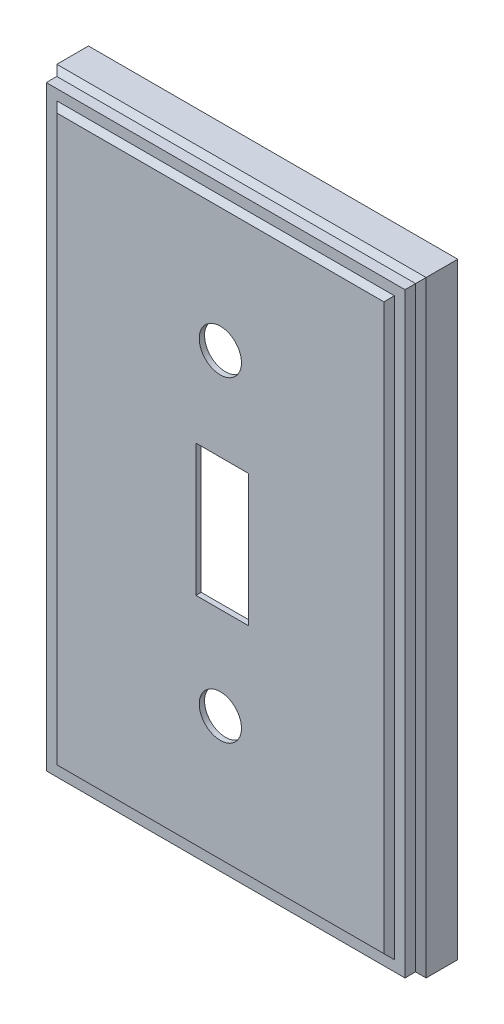
ISO-10303-21;
HEADER;
FILE_DESCRIPTION(('STEP AP214'),'2;1');
FILE_NAME('part.step','',(''),(''),'','','');
FILE_SCHEMA(('AUTOMOTIVE_DESIGN { 1 0 10303 214 1 1 1 1 }'));
ENDSEC;
DATA;
#1=APPLICATION_CONTEXT('core data for automotive mechanical design processes');
#2=APPLICATION_PROTOCOL_DEFINITION('international standard','automotive_design',2000,#1);
#3=PRODUCT_CONTEXT('',#1,'mechanical');
#4=PRODUCT('Part','Part','',(#3));
#5=PRODUCT_RELATED_PRODUCT_CATEGORY('part','',(#4));
#6=PRODUCT_DEFINITION_FORMATION('','',#4);
#7=PRODUCT_DEFINITION_CONTEXT('part definition',#1,'design');
#8=PRODUCT_DEFINITION('design','',#6,#7);
#9=PRODUCT_DEFINITION_SHAPE('','',#8);
#10=(LENGTH_UNIT() NAMED_UNIT(*) SI_UNIT(.MILLI.,.METRE.));
#11=(NAMED_UNIT(*) PLANE_ANGLE_UNIT() SI_UNIT($,.RADIAN.));
#12=(NAMED_UNIT(*) SI_UNIT($,.STERADIAN.) SOLID_ANGLE_UNIT());
#13=UNCERTAINTY_MEASURE_WITH_UNIT(LENGTH_MEASURE(1.E-05),#10,'distance_accuracy_value','');
#14=(GEOMETRIC_REPRESENTATION_CONTEXT(3) GLOBAL_UNCERTAINTY_ASSIGNED_CONTEXT((#13)) GLOBAL_UNIT_ASSIGNED_CONTEXT((#10,
#11,#12)) REPRESENTATION_CONTEXT('',''));
#15=CARTESIAN_POINT('',(0.,0.,0.));
#16=DIRECTION('',(0.,0.,1.));
#17=DIRECTION('',(1.,0.,0.));
#18=AXIS2_PLACEMENT_3D('',#15,#16,#17);
#19=CARTESIAN_POINT('',(0.,0.,10.));
#20=DIRECTION('',(1.,0.,0.));
#21=DIRECTION('',(0.,1.,0.));
#22=AXIS2_PLACEMENT_3D('',#19,#20,#21);
#23=PLANE('',#22);
#24=DIRECTION('',(0.,0.,-1.));
#25=VECTOR('',#24,1.);
#26=CARTESIAN_POINT('',(0.,-115.,10.));
#27=LINE('',#26,#25);
#28=CARTESIAN_POINT('',(0.,-115.,6.00000000000001));
#29=VERTEX_POINT('',#28);
#30=CARTESIAN_POINT('',(0.,-115.,0.));
#31=VERTEX_POINT('',#30);
#32=EDGE_CURVE('E225',#29,#31,#27,.T.);
#33=ORIENTED_EDGE('',*,*,#32,.F.);
#34=DIRECTION('',(0.,1.,0.));
#35=VECTOR('',#34,1.);
#36=CARTESIAN_POINT('',(0.,0.,6.00000000000001));
#37=LINE('',#36,#35);
#38=CARTESIAN_POINT('',(0.,0.,6.00000000000001));
#39=VERTEX_POINT('',#38);
#40=EDGE_CURVE('E57',#29,#39,#37,.T.);
#41=ORIENTED_EDGE('',*,*,#40,.T.);
#42=DIRECTION('',(0.,0.,-1.));
#43=VECTOR('',#42,1.);
#44=CARTESIAN_POINT('',(0.,0.,10.));
#45=LINE('',#44,#43);
#46=CARTESIAN_POINT('',(0.,0.,0.));
#47=VERTEX_POINT('',#46);
#48=EDGE_CURVE('E219',#39,#47,#45,.T.);
#49=ORIENTED_EDGE('',*,*,#48,.T.);
#50=DIRECTION('',(0.,-1.,0.));
#51=VECTOR('',#50,1.);
#52=CARTESIAN_POINT('',(0.,0.,0.));
#53=LINE('',#52,#51);
#54=EDGE_CURVE('E179',#47,#31,#53,.T.);
#55=ORIENTED_EDGE('',*,*,#54,.T.);
#56=EDGE_LOOP('',(#33,#41,#49,#55));
#57=FACE_BOUND('',#56,.T.);
#58=ADVANCED_FACE('F33',(#57),#23,.F.);
#59=CARTESIAN_POINT('',(0.,-115.,10.));
#60=DIRECTION('',(0.,1.,0.));
#61=DIRECTION('',(0.,0.,1.));
#62=AXIS2_PLACEMENT_3D('',#59,#60,#61);
#63=PLANE('',#62);
#64=DIRECTION('',(0.,0.,-1.));
#65=VECTOR('',#64,1.);
#66=CARTESIAN_POINT('',(70.,-115.,10.));
#67=LINE('',#66,#65);
#68=CARTESIAN_POINT('',(70.,-115.,6.00000000000001));
#69=VERTEX_POINT('',#68);
#70=CARTESIAN_POINT('',(70.,-115.,0.));
#71=VERTEX_POINT('',#70);
#72=EDGE_CURVE('E223',#69,#71,#67,.T.);
#73=ORIENTED_EDGE('',*,*,#72,.F.);
#74=DIRECTION('',(-1.,0.,0.));
#75=VECTOR('',#74,1.);
#76=CARTESIAN_POINT('',(0.,-115.,6.00000000000001));
#77=LINE('',#76,#75);
#78=EDGE_CURVE('E249',#69,#29,#77,.T.);
#79=ORIENTED_EDGE('',*,*,#78,.T.);
#80=ORIENTED_EDGE('',*,*,#32,.T.);
#81=DIRECTION('',(1.,0.,0.));
#82=VECTOR('',#81,1.);
#83=CARTESIAN_POINT('',(0.,-115.,0.));
#84=LINE('',#83,#82);
#85=EDGE_CURVE('E210',#31,#71,#84,.T.);
#86=ORIENTED_EDGE('',*,*,#85,.T.);
#87=EDGE_LOOP('',(#73,#79,#80,#86));
#88=FACE_BOUND('',#87,.T.);
#89=ADVANCED_FACE('F291',(#88),#63,.F.);
#90=CARTESIAN_POINT('',(70.,0.,10.));
#91=DIRECTION('',(-1.,0.,0.));
#92=DIRECTION('',(0.,-1.,0.));
#93=AXIS2_PLACEMENT_3D('',#90,#91,#92);
#94=PLANE('',#93);
#95=DIRECTION('',(0.,0.,-1.));
#96=VECTOR('',#95,1.);
#97=CARTESIAN_POINT('',(70.,0.,10.));
#98=LINE('',#97,#96);
#99=CARTESIAN_POINT('',(70.,0.,6.00000000000001));
#100=VERTEX_POINT('',#99);
#101=CARTESIAN_POINT('',(70.,0.,0.));
#102=VERTEX_POINT('',#101);
#103=EDGE_CURVE('E221',#100,#102,#98,.T.);
#104=ORIENTED_EDGE('',*,*,#103,.F.);
#105=DIRECTION('',(0.,-1.,0.));
#106=VECTOR('',#105,1.);
#107=CARTESIAN_POINT('',(70.,-115.,6.00000000000001));
#108=LINE('',#107,#106);
#109=EDGE_CURVE('E11',#100,#69,#108,.T.);
#110=ORIENTED_EDGE('',*,*,#109,.T.);
#111=ORIENTED_EDGE('',*,*,#72,.T.);
#112=DIRECTION('',(0.,1.,0.));
#113=VECTOR('',#112,1.);
#114=CARTESIAN_POINT('',(70.,0.,0.));
#115=LINE('',#114,#113);
#116=EDGE_CURVE('E213',#71,#102,#115,.T.);
#117=ORIENTED_EDGE('',*,*,#116,.T.);
#118=EDGE_LOOP('',(#104,#110,#111,#117));
#119=FACE_BOUND('',#118,.T.);
#120=ADVANCED_FACE('F287',(#119),#94,.F.);
#121=CARTESIAN_POINT('',(0.,0.,10.));
#122=DIRECTION('',(0.,-1.,0.));
#123=DIRECTION('',(0.,0.,-1.));
#124=AXIS2_PLACEMENT_3D('',#121,#122,#123);
#125=PLANE('',#124);
#126=ORIENTED_EDGE('',*,*,#48,.F.);
#127=DIRECTION('',(1.,0.,0.));
#128=VECTOR('',#127,1.);
#129=CARTESIAN_POINT('',(70.,0.,6.00000000000001));
#130=LINE('',#129,#128);
#131=EDGE_CURVE('E42',#39,#100,#130,.T.);
#132=ORIENTED_EDGE('',*,*,#131,.T.);
#133=ORIENTED_EDGE('',*,*,#103,.T.);
#134=DIRECTION('',(-1.,0.,0.));
#135=VECTOR('',#134,1.);
#136=CARTESIAN_POINT('',(0.,0.,0.));
#137=LINE('',#136,#135);
#138=EDGE_CURVE('E216',#102,#47,#137,.T.);
#139=ORIENTED_EDGE('',*,*,#138,.T.);
#140=EDGE_LOOP('',(#126,#132,#133,#139));
#141=FACE_BOUND('',#140,.T.);
#142=ADVANCED_FACE('F277',(#141),#125,.F.);
#143=CARTESIAN_POINT('',(0.,0.,10.));
#144=DIRECTION('',(0.,0.,1.));
#145=DIRECTION('',(1.,0.,0.));
#146=AXIS2_PLACEMENT_3D('',#143,#144,#145);
#147=PLANE('',#146);
#148=DIRECTION('',(0.,-1.,0.));
#149=VECTOR('',#148,1.);
#150=CARTESIAN_POINT('',(4.,-115.,10.));
#151=LINE('',#150,#149);
#152=CARTESIAN_POINT('',(3.99999999999999,-3.99999999999999,10.));
#153=VERTEX_POINT('',#152);
#154=CARTESIAN_POINT('',(4.,-111.,10.));
#155=VERTEX_POINT('',#154);
#156=EDGE_CURVE('E244',#153,#155,#151,.T.);
#157=ORIENTED_EDGE('',*,*,#156,.T.);
#158=DIRECTION('',(1.,0.,0.));
#159=VECTOR('',#158,1.);
#160=CARTESIAN_POINT('',(70.,-111.,10.));
#161=LINE('',#160,#159);
#162=CARTESIAN_POINT('',(66.,-111.,10.));
#163=VERTEX_POINT('',#162);
#164=EDGE_CURVE('E246',#155,#163,#161,.T.);
#165=ORIENTED_EDGE('',*,*,#164,.T.);
#166=DIRECTION('',(0.,1.,0.));
#167=VECTOR('',#166,1.);
#168=CARTESIAN_POINT('',(66.,0.,10.));
#169=LINE('',#168,#167);
#170=CARTESIAN_POINT('',(66.,-3.99999999999999,10.));
#171=VERTEX_POINT('',#170);
#172=EDGE_CURVE('E238',#163,#171,#169,.T.);
#173=ORIENTED_EDGE('',*,*,#172,.T.);
#174=DIRECTION('',(-1.,0.,0.));
#175=VECTOR('',#174,1.);
#176=CARTESIAN_POINT('',(0.,-3.99999999999999,10.));
#177=LINE('',#176,#175);
#178=EDGE_CURVE('E242',#171,#153,#177,.T.);
#179=ORIENTED_EDGE('',*,*,#178,.T.);
#180=EDGE_LOOP('',(#157,#165,#173,#179));
#181=FACE_BOUND('',#180,.T.);
#182=CARTESIAN_POINT('',(35.,-87.5,10.));
#183=DIRECTION('',(0.,0.,1.));
#184=DIRECTION('',(1.,0.,0.));
#185=AXIS2_PLACEMENT_3D('',#182,#183,#184);
#186=CIRCLE('',#185,4.00000000000001);
#187=CARTESIAN_POINT('',(39.,-87.5,10.));
#188=VERTEX_POINT('',#187);
#189=EDGE_CURVE('E168',#188,#188,#186,.T.);
#190=ORIENTED_EDGE('',*,*,#189,.F.);
#191=EDGE_LOOP('',(#190));
#192=FACE_BOUND('',#191,.T.);
#193=DIRECTION('',(0.,-1.,0.));
#194=VECTOR('',#193,1.);
#195=CARTESIAN_POINT('',(30.369677272136,-45.,10.));
#196=LINE('',#195,#194);
#197=CARTESIAN_POINT('',(30.369677272136,-45.,10.));
#198=VERTEX_POINT('',#197);
#199=CARTESIAN_POINT('',(30.369677272136,-70.,10.));
#200=VERTEX_POINT('',#199);
#201=EDGE_CURVE('E156',#198,#200,#196,.T.);
#202=ORIENTED_EDGE('',*,*,#201,.F.);
#203=DIRECTION('',(-1.,0.,0.));
#204=VECTOR('',#203,1.);
#205=CARTESIAN_POINT('',(30.369677272136,-45.,10.));
#206=LINE('',#205,#204);
#207=CARTESIAN_POINT('',(40.369677272136,-45.,10.));
#208=VERTEX_POINT('',#207);
#209=EDGE_CURVE('E161',#208,#198,#206,.T.);
#210=ORIENTED_EDGE('',*,*,#209,.F.);
#211=DIRECTION('',(0.,1.,0.));
#212=VECTOR('',#211,1.);
#213=CARTESIAN_POINT('',(40.369677272136,-45.,10.));
#214=LINE('',#213,#212);
#215=CARTESIAN_POINT('',(40.369677272136,-70.,10.));
#216=VERTEX_POINT('',#215);
#217=EDGE_CURVE('E140',#216,#208,#214,.T.);
#218=ORIENTED_EDGE('',*,*,#217,.F.);
#219=DIRECTION('',(1.,0.,0.));
#220=VECTOR('',#219,1.);
#221=CARTESIAN_POINT('',(30.369677272136,-70.,10.));
#222=LINE('',#221,#220);
#223=EDGE_CURVE('E151',#200,#216,#222,.T.);
#224=ORIENTED_EDGE('',*,*,#223,.F.);
#225=EDGE_LOOP('',(#202,#210,#218,#224));
#226=FACE_BOUND('',#225,.T.);
#227=CARTESIAN_POINT('',(35.,-27.5,10.));
#228=DIRECTION('',(0.,0.,1.));
#229=DIRECTION('',(1.,0.,0.));
#230=AXIS2_PLACEMENT_3D('',#227,#228,#229);
#231=CIRCLE('',#230,4.00000000000001);
#232=CARTESIAN_POINT('',(39.,-27.5,10.));
#233=VERTEX_POINT('',#232);
#234=EDGE_CURVE('E171',#233,#233,#231,.T.);
#235=ORIENTED_EDGE('',*,*,#234,.F.);
#236=EDGE_LOOP('',(#235));
#237=FACE_BOUND('',#236,.T.);
#238=ADVANCED_FACE('F158',(#181,#192,#226,#237),#147,.T.);
#239=CARTESIAN_POINT('',(0.,0.,0.));
#240=DIRECTION('',(0.,0.,1.));
#241=DIRECTION('',(1.,0.,0.));
#242=AXIS2_PLACEMENT_3D('',#239,#240,#241);
#243=PLANE('',#242);
#244=DIRECTION('',(-1.,0.,0.));
#245=VECTOR('',#244,1.);
#246=CARTESIAN_POINT('',(0.,-1.,0.));
#247=LINE('',#246,#245);
#248=CARTESIAN_POINT('',(69.,-1.,0.));
#249=VERTEX_POINT('',#248);
#250=CARTESIAN_POINT('',(1.,-1.,0.));
#251=VERTEX_POINT('',#250);
#252=EDGE_CURVE('E185',#249,#251,#247,.T.);
#253=ORIENTED_EDGE('',*,*,#252,.T.);
#254=DIRECTION('',(0.,-1.,0.));
#255=VECTOR('',#254,1.);
#256=CARTESIAN_POINT('',(1.,0.,0.));
#257=LINE('',#256,#255);
#258=CARTESIAN_POINT('',(1.00000000000001,-114.,0.));
#259=VERTEX_POINT('',#258);
#260=EDGE_CURVE('E197',#251,#259,#257,.T.);
#261=ORIENTED_EDGE('',*,*,#260,.T.);
#262=DIRECTION('',(1.,0.,0.));
#263=VECTOR('',#262,1.);
#264=CARTESIAN_POINT('',(0.,-114.,0.));
#265=LINE('',#264,#263);
#266=CARTESIAN_POINT('',(69.,-114.,0.));
#267=VERTEX_POINT('',#266);
#268=EDGE_CURVE('E200',#259,#267,#265,.T.);
#269=ORIENTED_EDGE('',*,*,#268,.T.);
#270=DIRECTION('',(0.,1.,0.));
#271=VECTOR('',#270,1.);
#272=CARTESIAN_POINT('',(69.,0.,0.));
#273=LINE('',#272,#271);
#274=EDGE_CURVE('E203',#267,#249,#273,.T.);
#275=ORIENTED_EDGE('',*,*,#274,.T.);
#276=EDGE_LOOP('',(#253,#261,#269,#275));
#277=FACE_BOUND('',#276,.T.);
#278=ORIENTED_EDGE('',*,*,#54,.F.);
#279=ORIENTED_EDGE('',*,*,#138,.F.);
#280=ORIENTED_EDGE('',*,*,#116,.F.);
#281=ORIENTED_EDGE('',*,*,#85,.F.);
#282=EDGE_LOOP('',(#278,#279,#280,#281));
#283=FACE_BOUND('',#282,.T.);
#284=ADVANCED_FACE('F276',(#277,#283),#243,.F.);
#285=CARTESIAN_POINT('',(1.,0.,10.));
#286=DIRECTION('',(1.,0.,0.));
#287=DIRECTION('',(0.,1.,0.));
#288=AXIS2_PLACEMENT_3D('',#285,#286,#287);
#289=PLANE('',#288);
#290=ORIENTED_EDGE('',*,*,#260,.F.);
#291=DIRECTION('',(0.,0.,-1.));
#292=VECTOR('',#291,1.);
#293=CARTESIAN_POINT('',(1.,-1.,10.));
#294=LINE('',#293,#292);
#295=CARTESIAN_POINT('',(1.,-1.,9.));
#296=VERTEX_POINT('',#295);
#297=EDGE_CURVE('E186',#296,#251,#294,.T.);
#298=ORIENTED_EDGE('',*,*,#297,.F.);
#299=DIRECTION('',(0.,-1.,0.));
#300=VECTOR('',#299,1.);
#301=CARTESIAN_POINT('',(1.,0.,9.));
#302=LINE('',#301,#300);
#303=CARTESIAN_POINT('',(1.00000000000001,-114.,9.));
#304=VERTEX_POINT('',#303);
#305=EDGE_CURVE('E181',#296,#304,#302,.T.);
#306=ORIENTED_EDGE('',*,*,#305,.T.);
#307=DIRECTION('',(0.,0.,-1.));
#308=VECTOR('',#307,1.);
#309=CARTESIAN_POINT('',(1.00000000000001,-114.,10.));
#310=LINE('',#309,#308);
#311=EDGE_CURVE('E176',#304,#259,#310,.T.);
#312=ORIENTED_EDGE('',*,*,#311,.T.);
#313=EDGE_LOOP('',(#290,#298,#306,#312));
#314=FACE_BOUND('',#313,.T.);
#315=ADVANCED_FACE('F284',(#314),#289,.T.);
#316=CARTESIAN_POINT('',(0.,-114.,10.));
#317=DIRECTION('',(0.,1.,0.));
#318=DIRECTION('',(0.,0.,1.));
#319=AXIS2_PLACEMENT_3D('',#316,#317,#318);
#320=PLANE('',#319);
#321=ORIENTED_EDGE('',*,*,#268,.F.);
#322=ORIENTED_EDGE('',*,*,#311,.F.);
#323=DIRECTION('',(1.,0.,0.));
#324=VECTOR('',#323,1.);
#325=CARTESIAN_POINT('',(0.,-114.,9.));
#326=LINE('',#325,#324);
#327=CARTESIAN_POINT('',(69.,-114.,9.));
#328=VERTEX_POINT('',#327);
#329=EDGE_CURVE('E184',#304,#328,#326,.T.);
#330=ORIENTED_EDGE('',*,*,#329,.T.);
#331=DIRECTION('',(0.,0.,-1.));
#332=VECTOR('',#331,1.);
#333=CARTESIAN_POINT('',(69.,-114.,10.));
#334=LINE('',#333,#332);
#335=EDGE_CURVE('E180',#328,#267,#334,.T.);
#336=ORIENTED_EDGE('',*,*,#335,.T.);
#337=EDGE_LOOP('',(#321,#322,#330,#336));
#338=FACE_BOUND('',#337,.T.);
#339=ADVANCED_FACE('F435',(#338),#320,.T.);
#340=CARTESIAN_POINT('',(69.,0.,10.));
#341=DIRECTION('',(-1.,0.,0.));
#342=DIRECTION('',(0.,-1.,0.));
#343=AXIS2_PLACEMENT_3D('',#340,#341,#342);
#344=PLANE('',#343);
#345=ORIENTED_EDGE('',*,*,#274,.F.);
#346=ORIENTED_EDGE('',*,*,#335,.F.);
#347=DIRECTION('',(0.,1.,0.));
#348=VECTOR('',#347,1.);
#349=CARTESIAN_POINT('',(69.,0.,9.));
#350=LINE('',#349,#348);
#351=CARTESIAN_POINT('',(69.,-1.,9.));
#352=VERTEX_POINT('',#351);
#353=EDGE_CURVE('E193',#328,#352,#350,.T.);
#354=ORIENTED_EDGE('',*,*,#353,.T.);
#355=DIRECTION('',(0.,0.,-1.));
#356=VECTOR('',#355,1.);
#357=CARTESIAN_POINT('',(69.,-1.,10.));
#358=LINE('',#357,#356);
#359=EDGE_CURVE('E188',#352,#249,#358,.T.);
#360=ORIENTED_EDGE('',*,*,#359,.T.);
#361=EDGE_LOOP('',(#345,#346,#354,#360));
#362=FACE_BOUND('',#361,.T.);
#363=ADVANCED_FACE('F426',(#362),#344,.T.);
#364=CARTESIAN_POINT('',(0.,-1.,10.));
#365=DIRECTION('',(0.,-1.,0.));
#366=DIRECTION('',(0.,0.,-1.));
#367=AXIS2_PLACEMENT_3D('',#364,#365,#366);
#368=PLANE('',#367);
#369=ORIENTED_EDGE('',*,*,#252,.F.);
#370=ORIENTED_EDGE('',*,*,#359,.F.);
#371=DIRECTION('',(-1.,0.,0.));
#372=VECTOR('',#371,1.);
#373=CARTESIAN_POINT('',(0.,-1.,9.));
#374=LINE('',#373,#372);
#375=EDGE_CURVE('E189',#352,#296,#374,.T.);
#376=ORIENTED_EDGE('',*,*,#375,.T.);
#377=ORIENTED_EDGE('',*,*,#297,.T.);
#378=EDGE_LOOP('',(#369,#370,#376,#377));
#379=FACE_BOUND('',#378,.T.);
#380=ADVANCED_FACE('F418',(#379),#368,.T.);
#381=CARTESIAN_POINT('',(0.,0.,9.));
#382=DIRECTION('',(0.,0.,1.));
#383=DIRECTION('',(1.,0.,0.));
#384=AXIS2_PLACEMENT_3D('',#381,#382,#383);
#385=PLANE('',#384);
#386=CARTESIAN_POINT('',(35.,-87.5,9.));
#387=DIRECTION('',(0.,0.,1.));
#388=DIRECTION('',(1.,0.,0.));
#389=AXIS2_PLACEMENT_3D('',#386,#387,#388);
#390=CIRCLE('',#389,4.00000000000001);
#391=CARTESIAN_POINT('',(39.,-87.5,9.));
#392=VERTEX_POINT('',#391);
#393=EDGE_CURVE('E175',#392,#392,#390,.T.);
#394=ORIENTED_EDGE('',*,*,#393,.T.);
#395=EDGE_LOOP('',(#394));
#396=FACE_BOUND('',#395,.T.);
#397=DIRECTION('',(-1.,0.,0.));
#398=VECTOR('',#397,1.);
#399=CARTESIAN_POINT('',(0.,-45.,9.));
#400=LINE('',#399,#398);
#401=CARTESIAN_POINT('',(40.369677272136,-45.,9.));
#402=VERTEX_POINT('',#401);
#403=CARTESIAN_POINT('',(30.369677272136,-45.,9.));
#404=VERTEX_POINT('',#403);
#405=EDGE_CURVE('E232',#402,#404,#400,.T.);
#406=ORIENTED_EDGE('',*,*,#405,.T.);
#407=DIRECTION('',(0.,-1.,0.));
#408=VECTOR('',#407,1.);
#409=CARTESIAN_POINT('',(30.3696772721359,0.,9.));
#410=LINE('',#409,#408);
#411=CARTESIAN_POINT('',(30.369677272136,-70.,9.));
#412=VERTEX_POINT('',#411);
#413=EDGE_CURVE('E235',#404,#412,#410,.T.);
#414=ORIENTED_EDGE('',*,*,#413,.T.);
#415=DIRECTION('',(1.,0.,0.));
#416=VECTOR('',#415,1.);
#417=CARTESIAN_POINT('',(0.,-70.,9.));
#418=LINE('',#417,#416);
#419=CARTESIAN_POINT('',(40.369677272136,-70.,9.));
#420=VERTEX_POINT('',#419);
#421=EDGE_CURVE('E227',#412,#420,#418,.T.);
#422=ORIENTED_EDGE('',*,*,#421,.T.);
#423=DIRECTION('',(0.,1.,0.));
#424=VECTOR('',#423,1.);
#425=CARTESIAN_POINT('',(40.3696772721359,0.,9.));
#426=LINE('',#425,#424);
#427=EDGE_CURVE('E143',#420,#402,#426,.T.);
#428=ORIENTED_EDGE('',*,*,#427,.T.);
#429=EDGE_LOOP('',(#406,#414,#422,#428));
#430=FACE_BOUND('',#429,.T.);
#431=CARTESIAN_POINT('',(35.,-27.5,9.));
#432=DIRECTION('',(0.,0.,1.));
#433=DIRECTION('',(1.,0.,0.));
#434=AXIS2_PLACEMENT_3D('',#431,#432,#433);
#435=CIRCLE('',#434,4.00000000000001);
#436=CARTESIAN_POINT('',(39.,-27.5,9.));
#437=VERTEX_POINT('',#436);
#438=EDGE_CURVE('E174',#437,#437,#435,.T.);
#439=ORIENTED_EDGE('',*,*,#438,.T.);
#440=EDGE_LOOP('',(#439));
#441=FACE_BOUND('',#440,.T.);
#442=ORIENTED_EDGE('',*,*,#305,.F.);
#443=ORIENTED_EDGE('',*,*,#375,.F.);
#444=ORIENTED_EDGE('',*,*,#353,.F.);
#445=ORIENTED_EDGE('',*,*,#329,.F.);
#446=EDGE_LOOP('',(#442,#443,#444,#445));
#447=FACE_BOUND('',#446,.T.);
#448=ADVANCED_FACE('F409',(#396,#430,#441,#447),#385,.F.);
#449=CARTESIAN_POINT('',(35.,-27.5,-26.9258240356725));
#450=DIRECTION('',(0.,0.,1.));
#451=DIRECTION('',(1.,0.,0.));
#452=AXIS2_PLACEMENT_3D('',#449,#450,#451);
#453=CYLINDRICAL_SURFACE('',#452,4.00000000000001);
#454=ORIENTED_EDGE('',*,*,#234,.T.);
#455=EDGE_LOOP('',(#454));
#456=FACE_BOUND('',#455,.T.);
#457=ORIENTED_EDGE('',*,*,#438,.F.);
#458=EDGE_LOOP('',(#457));
#459=FACE_BOUND('',#458,.T.);
#460=ADVANCED_FACE('F401',(#456,#459),#453,.F.);
#461=CARTESIAN_POINT('',(30.369677272136,-45.,-26.9258240356725));
#462=DIRECTION('',(-1.,0.,0.));
#463=DIRECTION('',(0.,-1.,0.));
#464=AXIS2_PLACEMENT_3D('',#461,#462,#463);
#465=PLANE('',#464);
#466=DIRECTION('',(0.,0.,1.));
#467=VECTOR('',#466,1.);
#468=CARTESIAN_POINT('',(30.369677272136,-45.,-26.9258240356725));
#469=LINE('',#468,#467);
#470=EDGE_CURVE('E166',#404,#198,#469,.T.);
#471=ORIENTED_EDGE('',*,*,#470,.T.);
#472=ORIENTED_EDGE('',*,*,#201,.T.);
#473=DIRECTION('',(0.,0.,1.));
#474=VECTOR('',#473,1.);
#475=CARTESIAN_POINT('',(30.369677272136,-70.,-26.9258240356725));
#476=LINE('',#475,#474);
#477=EDGE_CURVE('E147',#412,#200,#476,.T.);
#478=ORIENTED_EDGE('',*,*,#477,.F.);
#479=ORIENTED_EDGE('',*,*,#413,.F.);
#480=EDGE_LOOP('',(#471,#472,#478,#479));
#481=FACE_BOUND('',#480,.T.);
#482=ADVANCED_FACE('F392',(#481),#465,.F.);
#483=CARTESIAN_POINT('',(30.369677272136,-45.,-26.9258240356725));
#484=DIRECTION('',(0.,1.,0.));
#485=DIRECTION('',(-1.,0.,0.));
#486=AXIS2_PLACEMENT_3D('',#483,#484,#485);
#487=PLANE('',#486);
#488=DIRECTION('',(0.,0.,1.));
#489=VECTOR('',#488,1.);
#490=CARTESIAN_POINT('',(40.369677272136,-45.,-26.9258240356725));
#491=LINE('',#490,#489);
#492=EDGE_CURVE('E146',#402,#208,#491,.T.);
#493=ORIENTED_EDGE('',*,*,#492,.T.);
#494=ORIENTED_EDGE('',*,*,#209,.T.);
#495=ORIENTED_EDGE('',*,*,#470,.F.);
#496=ORIENTED_EDGE('',*,*,#405,.F.);
#497=EDGE_LOOP('',(#493,#494,#495,#496));
#498=FACE_BOUND('',#497,.T.);
#499=ADVANCED_FACE('F384',(#498),#487,.F.);
#500=CARTESIAN_POINT('',(40.369677272136,-45.,-26.9258240356725));
#501=DIRECTION('',(1.,0.,0.));
#502=DIRECTION('',(0.,1.,0.));
#503=AXIS2_PLACEMENT_3D('',#500,#501,#502);
#504=PLANE('',#503);
#505=DIRECTION('',(0.,0.,1.));
#506=VECTOR('',#505,1.);
#507=CARTESIAN_POINT('',(40.369677272136,-70.,-26.9258240356725));
#508=LINE('',#507,#506);
#509=EDGE_CURVE('E135',#420,#216,#508,.T.);
#510=ORIENTED_EDGE('',*,*,#509,.T.);
#511=ORIENTED_EDGE('',*,*,#217,.T.);
#512=ORIENTED_EDGE('',*,*,#492,.F.);
#513=ORIENTED_EDGE('',*,*,#427,.F.);
#514=EDGE_LOOP('',(#510,#511,#512,#513));
#515=FACE_BOUND('',#514,.T.);
#516=ADVANCED_FACE('F137',(#515),#504,.F.);
#517=CARTESIAN_POINT('',(30.369677272136,-70.,-26.9258240356725));
#518=DIRECTION('',(0.,-1.,0.));
#519=DIRECTION('',(0.,0.,-1.));
#520=AXIS2_PLACEMENT_3D('',#517,#518,#519);
#521=PLANE('',#520);
#522=ORIENTED_EDGE('',*,*,#477,.T.);
#523=ORIENTED_EDGE('',*,*,#223,.T.);
#524=ORIENTED_EDGE('',*,*,#509,.F.);
#525=ORIENTED_EDGE('',*,*,#421,.F.);
#526=EDGE_LOOP('',(#522,#523,#524,#525));
#527=FACE_BOUND('',#526,.T.);
#528=ADVANCED_FACE('F152',(#527),#521,.F.);
#529=CARTESIAN_POINT('',(35.,-87.5,-26.9258240356725));
#530=DIRECTION('',(0.,0.,1.));
#531=DIRECTION('',(1.,0.,0.));
#532=AXIS2_PLACEMENT_3D('',#529,#530,#531);
#533=CYLINDRICAL_SURFACE('',#532,4.00000000000001);
#534=ORIENTED_EDGE('',*,*,#189,.T.);
#535=EDGE_LOOP('',(#534));
#536=FACE_BOUND('',#535,.T.);
#537=ORIENTED_EDGE('',*,*,#393,.F.);
#538=EDGE_LOOP('',(#537));
#539=FACE_BOUND('',#538,.T.);
#540=ADVANCED_FACE('F272',(#536,#539),#533,.F.);
#541=CARTESIAN_POINT('',(0.,-3.99999999999999,10.));
#542=DIRECTION('',(0.,0.707106781186548,0.707106781186548));
#543=DIRECTION('',(1.,0.,0.));
#544=AXIS2_PLACEMENT_3D('',#541,#542,#543);
#545=PLANE('',#544);
#546=DIRECTION('',(-0.577350269189626,-0.577350269189626,0.577350269189626));
#547=VECTOR('',#546,1.);
#548=CARTESIAN_POINT('',(67.3333333333334,-2.66666666666665,8.66666666666667));
#549=LINE('',#548,#547);
#550=EDGE_CURVE('E257',#100,#171,#549,.T.);
#551=ORIENTED_EDGE('',*,*,#550,.F.);
#552=ORIENTED_EDGE('',*,*,#131,.F.);
#553=DIRECTION('',(0.577350269189626,-0.577350269189626,0.577350269189626));
#554=VECTOR('',#553,1.);
#555=CARTESIAN_POINT('',(2.66666666666666,-2.66666666666666,8.66666666666667));
#556=LINE('',#555,#554);
#557=EDGE_CURVE('E37',#153,#39,#556,.F.);
#558=ORIENTED_EDGE('',*,*,#557,.F.);
#559=ORIENTED_EDGE('',*,*,#178,.F.);
#560=EDGE_LOOP('',(#551,#552,#558,#559));
#561=FACE_BOUND('',#560,.T.);
#562=ADVANCED_FACE('F35',(#561),#545,.T.);
#563=CARTESIAN_POINT('',(3.99999999999999,0.,10.));
#564=DIRECTION('',(-0.707106781186548,0.,0.707106781186548));
#565=DIRECTION('',(0.,1.,0.));
#566=AXIS2_PLACEMENT_3D('',#563,#564,#565);
#567=PLANE('',#566);
#568=ORIENTED_EDGE('',*,*,#557,.T.);
#569=ORIENTED_EDGE('',*,*,#40,.F.);
#570=DIRECTION('',(0.577350269189626,0.577350269189626,0.577350269189626));
#571=VECTOR('',#570,1.);
#572=CARTESIAN_POINT('',(41.,-74.,47.));
#573=LINE('',#572,#571);
#574=EDGE_CURVE('E256',#155,#29,#573,.F.);
#575=ORIENTED_EDGE('',*,*,#574,.F.);
#576=ORIENTED_EDGE('',*,*,#156,.F.);
#577=EDGE_LOOP('',(#568,#569,#575,#576));
#578=FACE_BOUND('',#577,.T.);
#579=ADVANCED_FACE('F306',(#578),#567,.T.);
#580=CARTESIAN_POINT('',(66.,0.,10.));
#581=DIRECTION('',(0.707106781186548,0.,0.707106781186548));
#582=DIRECTION('',(0.,-1.,0.));
#583=AXIS2_PLACEMENT_3D('',#580,#581,#582);
#584=PLANE('',#583);
#585=ORIENTED_EDGE('',*,*,#550,.T.);
#586=ORIENTED_EDGE('',*,*,#172,.F.);
#587=DIRECTION('',(0.577350269189626,-0.577350269189626,-0.577350269189626));
#588=VECTOR('',#587,1.);
#589=CARTESIAN_POINT('',(29.,-74.,47.));
#590=LINE('',#589,#588);
#591=EDGE_CURVE('E254',#69,#163,#590,.F.);
#592=ORIENTED_EDGE('',*,*,#591,.F.);
#593=ORIENTED_EDGE('',*,*,#109,.F.);
#594=EDGE_LOOP('',(#585,#586,#592,#593));
#595=FACE_BOUND('',#594,.T.);
#596=ADVANCED_FACE('F303',(#595),#584,.T.);
#597=CARTESIAN_POINT('',(0.,-111.,10.));
#598=DIRECTION('',(0.,-0.707106781186548,0.707106781186548));
#599=DIRECTION('',(-1.,0.,0.));
#600=AXIS2_PLACEMENT_3D('',#597,#598,#599);
#601=PLANE('',#600);
#602=ORIENTED_EDGE('',*,*,#574,.T.);
#603=ORIENTED_EDGE('',*,*,#78,.F.);
#604=ORIENTED_EDGE('',*,*,#591,.T.);
#605=ORIENTED_EDGE('',*,*,#164,.F.);
#606=EDGE_LOOP('',(#602,#603,#604,#605));
#607=FACE_BOUND('',#606,.T.);
#608=ADVANCED_FACE('F300',(#607),#601,.T.);
#609=CLOSED_SHELL('',(#58,#89,#120,#142,#238,#284,#315,#339,#363,#380,#448,#460,#482,#499,#516,
#528,#540,#562,#579,#596,#608));
#610=MANIFOLD_SOLID_BREP('B2',#609);
#611=ADVANCED_BREP_SHAPE_REPRESENTATION('',(#18,#610),#14);
#612=SHAPE_DEFINITION_REPRESENTATION(#9,#611);
ENDSEC;
END-ISO-10303-21;
